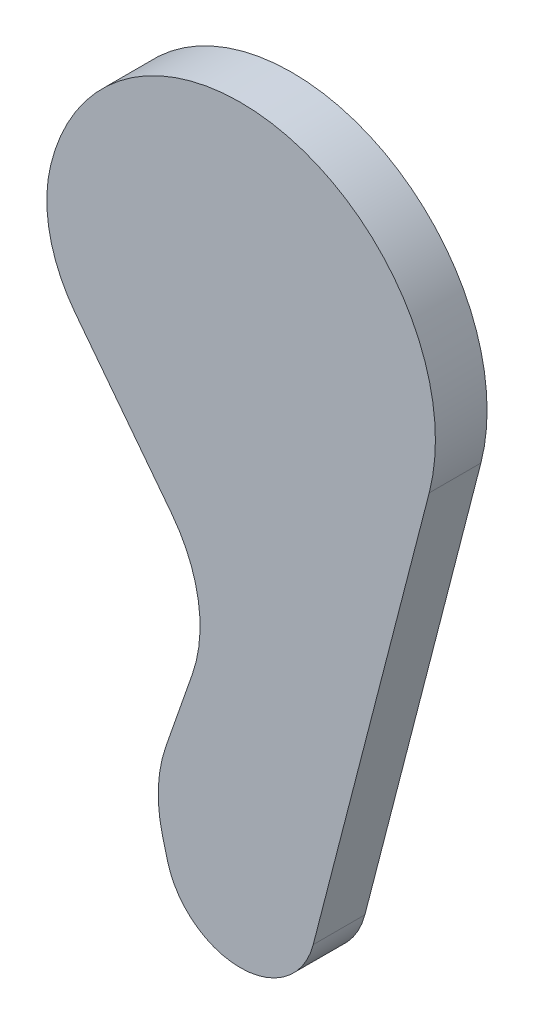
ISO-10303-21;
HEADER;
FILE_DESCRIPTION(('STEP AP214'),'2;1');
FILE_NAME('part.step','',(''),(''),'','','');
FILE_SCHEMA(('AUTOMOTIVE_DESIGN { 1 0 10303 214 1 1 1 1 }'));
ENDSEC;
DATA;
#1=APPLICATION_CONTEXT('core data for automotive mechanical design processes');
#2=APPLICATION_PROTOCOL_DEFINITION('international standard','automotive_design',2000,#1);
#3=PRODUCT_CONTEXT('',#1,'mechanical');
#4=PRODUCT('Part','Part','',(#3));
#5=PRODUCT_RELATED_PRODUCT_CATEGORY('part','',(#4));
#6=PRODUCT_DEFINITION_FORMATION('','',#4);
#7=PRODUCT_DEFINITION_CONTEXT('part definition',#1,'design');
#8=PRODUCT_DEFINITION('design','',#6,#7);
#9=PRODUCT_DEFINITION_SHAPE('','',#8);
#10=(LENGTH_UNIT() NAMED_UNIT(*) SI_UNIT(.MILLI.,.METRE.));
#11=(NAMED_UNIT(*) PLANE_ANGLE_UNIT() SI_UNIT($,.RADIAN.));
#12=(NAMED_UNIT(*) SI_UNIT($,.STERADIAN.) SOLID_ANGLE_UNIT());
#13=UNCERTAINTY_MEASURE_WITH_UNIT(LENGTH_MEASURE(1.E-05),#10,'distance_accuracy_value','');
#14=(GEOMETRIC_REPRESENTATION_CONTEXT(3) GLOBAL_UNCERTAINTY_ASSIGNED_CONTEXT((#13)) GLOBAL_UNIT_ASSIGNED_CONTEXT((#10,
#11,#12)) REPRESENTATION_CONTEXT('',''));
#15=CARTESIAN_POINT('',(0.,0.,0.));
#16=DIRECTION('',(0.,0.,1.));
#17=DIRECTION('',(1.,0.,0.));
#18=AXIS2_PLACEMENT_3D('',#15,#16,#17);
#19=CARTESIAN_POINT('',(0.,-70.,3.));
#20=DIRECTION('',(0.,0.,-1.));
#21=DIRECTION('',(-1.,0.,0.));
#22=AXIS2_PLACEMENT_3D('',#19,#20,#21);
#23=CYLINDRICAL_SURFACE('',#22,11.);
#24=DIRECTION('',(0.,0.,1.));
#25=VECTOR('',#24,1.);
#26=CARTESIAN_POINT('',(10.2953513590509,-66.1262756430421,-4.55));
#27=LINE('',#26,#25);
#28=CARTESIAN_POINT('',(10.2953513590509,-66.1262756430421,-4.55));
#29=VERTEX_POINT('',#28);
#30=CARTESIAN_POINT('',(10.2953513590509,-66.1262756430421,0.));
#31=VERTEX_POINT('',#30);
#32=EDGE_CURVE('E149',#29,#31,#27,.T.);
#33=ORIENTED_EDGE('',*,*,#32,.F.);
#34=CARTESIAN_POINT('',(0.,-70.,-4.55));
#35=DIRECTION('',(0.,0.,-1.));
#36=DIRECTION('',(-1.,0.,0.));
#37=AXIS2_PLACEMENT_3D('',#34,#35,#36);
#38=CIRCLE('',#37,11.);
#39=CARTESIAN_POINT('',(10.6507042020704,-72.75,-4.55));
#40=VERTEX_POINT('',#39);
#41=EDGE_CURVE('E161',#40,#29,#38,.T.);
#42=ORIENTED_EDGE('',*,*,#41,.F.);
#43=DIRECTION('',(0.,0.,-1.));
#44=VECTOR('',#43,1.);
#45=CARTESIAN_POINT('',(10.6507042020704,-72.75,3.));
#46=LINE('',#45,#44);
#47=CARTESIAN_POINT('',(10.6507042020704,-72.75,3.));
#48=VERTEX_POINT('',#47);
#49=EDGE_CURVE('E66',#48,#40,#46,.T.);
#50=ORIENTED_EDGE('',*,*,#49,.F.);
#51=CARTESIAN_POINT('',(0.,-70.,3.));
#52=DIRECTION('',(0.,0.,1.));
#53=DIRECTION('',(1.,0.,0.));
#54=AXIS2_PLACEMENT_3D('',#51,#52,#53);
#55=CIRCLE('',#54,11.);
#56=CARTESIAN_POINT('',(-10.6507042020704,-72.75,3.));
#57=VERTEX_POINT('',#56);
#58=EDGE_CURVE('E186',#57,#48,#55,.T.);
#59=ORIENTED_EDGE('',*,*,#58,.F.);
#60=DIRECTION('',(0.,0.,-1.));
#61=VECTOR('',#60,1.);
#62=CARTESIAN_POINT('',(-10.6507042020704,-72.75,3.));
#63=LINE('',#62,#61);
#64=CARTESIAN_POINT('',(-10.6507042020704,-72.75,0.));
#65=VERTEX_POINT('',#64);
#66=EDGE_CURVE('E195',#57,#65,#63,.T.);
#67=ORIENTED_EDGE('',*,*,#66,.T.);
#68=CARTESIAN_POINT('',(0.,-70.,0.));
#69=DIRECTION('',(0.,0.,-1.));
#70=DIRECTION('',(-1.,0.,0.));
#71=AXIS2_PLACEMENT_3D('',#68,#69,#70);
#72=CIRCLE('',#71,11.);
#73=EDGE_CURVE('E12',#65,#31,#72,.T.);
#74=ORIENTED_EDGE('',*,*,#73,.T.);
#75=EDGE_LOOP('',(#33,#42,#50,#59,#67,#74));
#76=FACE_BOUND('',#75,.T.);
#77=ADVANCED_FACE('F50',(#76),#23,.T.);
#78=CARTESIAN_POINT('',(0.,0.,0.));
#79=DIRECTION('',(0.,0.,1.));
#80=DIRECTION('',(1.,0.,0.));
#81=AXIS2_PLACEMENT_3D('',#78,#79,#80);
#82=PLANE('',#81);
#83=DIRECTION('',(0.25,0.968245836551854,0.));
#84=VECTOR('',#83,1.);
#85=CARTESIAN_POINT('',(10.2953513590509,-66.1262756430421,0.));
#86=LINE('',#85,#84);
#87=CARTESIAN_POINT('',(25.6585146686242,-6.62499999999997,0.));
#88=VERTEX_POINT('',#87);
#89=EDGE_CURVE('E269',#31,#88,#86,.T.);
#90=ORIENTED_EDGE('',*,*,#89,.F.);
#91=ORIENTED_EDGE('',*,*,#73,.F.);
#92=DIRECTION('',(0.25,-0.968245836551854,0.));
#93=VECTOR('',#92,1.);
#94=CARTESIAN_POINT('',(-27.5950063417278,-7.12500000000001,0.));
#95=LINE('',#94,#93);
#96=CARTESIAN_POINT('',(-11.3557061039309,-70.0195393750496,0.));
#97=VERTEX_POINT('',#96);
#98=EDGE_CURVE('E180',#97,#65,#95,.T.);
#99=ORIENTED_EDGE('',*,*,#98,.F.);
#100=CARTESIAN_POINT('',(8.00921062710618,-65.0195393750497,0.));
#101=DIRECTION('',(0.,0.,1.));
#102=DIRECTION('',(1.,0.,0.));
#103=AXIS2_PLACEMENT_3D('',#100,#101,#102);
#104=CIRCLE('',#103,20.);
#105=CARTESIAN_POINT('',(-10.8702555767009,-58.4191033395058,0.));
#106=VERTEX_POINT('',#105);
#107=EDGE_CURVE('E216',#97,#106,#104,.F.);
#108=ORIENTED_EDGE('',*,*,#107,.T.);
#109=DIRECTION('',(0.330021801777192,0.943973310190355,0.));
#110=VECTOR('',#109,1.);
#111=CARTESIAN_POINT('',(8.51307849523834,-2.97625099495946,0.));
#112=LINE('',#111,#110);
#113=CARTESIAN_POINT('',(-7.00149462201801,-47.3531462873932,0.));
#114=VERTEX_POINT('',#113);
#115=EDGE_CURVE('E197',#106,#114,#112,.T.);
#116=ORIENTED_EDGE('',*,*,#115,.T.);
#117=CARTESIAN_POINT('',(-25.8809608258251,-40.7527102518494,0.));
#118=DIRECTION('',(0.,0.,1.));
#119=DIRECTION('',(1.,0.,0.));
#120=AXIS2_PLACEMENT_3D('',#117,#118,#119);
#121=CIRCLE('',#120,20.);
#122=CARTESIAN_POINT('',(-10.0191798391824,-28.5705961524091,0.));
#123=VERTEX_POINT('',#122);
#124=EDGE_CURVE('E54',#114,#123,#121,.T.);
#125=ORIENTED_EDGE('',*,*,#124,.T.);
#126=DIRECTION('',(-0.609105704972012,0.793089049332134,0.));
#127=VECTOR('',#126,1.);
#128=CARTESIAN_POINT('',(-20.1037089124601,-15.43998596373,0.));
#129=LINE('',#128,#127);
#130=CARTESIAN_POINT('',(-24.1276033026681,-10.2006546777268,0.));
#131=VERTEX_POINT('',#130);
#132=EDGE_CURVE('E200',#123,#131,#129,.T.);
#133=ORIENTED_EDGE('',*,*,#132,.T.);
#134=CARTESIAN_POINT('',(-8.26582231602537,1.98145942171345,0.));
#135=DIRECTION('',(0.,0.,1.));
#136=DIRECTION('',(1.,0.,0.));
#137=AXIS2_PLACEMENT_3D('',#134,#135,#136);
#138=CIRCLE('',#137,20.);
#139=CARTESIAN_POINT('',(-27.7148160007909,6.64371688456864,0.));
#140=VERTEX_POINT('',#139);
#141=EDGE_CURVE('E213',#131,#140,#138,.F.);
#142=ORIENTED_EDGE('',*,*,#141,.T.);
#143=DIRECTION('',(-0.972449684238278,0.233112873142759,0.));
#144=VECTOR('',#143,1.);
#145=CARTESIAN_POINT('',(-25.7699166323144,6.17749113828312,0.));
#146=LINE('',#145,#144);
#147=CARTESIAN_POINT('',(-25.7699166323144,6.17749113828312,0.));
#148=VERTEX_POINT('',#147);
#149=EDGE_CURVE('E157',#148,#140,#146,.T.);
#150=ORIENTED_EDGE('',*,*,#149,.F.);
#151=CARTESIAN_POINT('',(0.,0.,0.));
#152=DIRECTION('',(0.,0.,1.));
#153=DIRECTION('',(-1.,0.,0.));
#154=AXIS2_PLACEMENT_3D('',#151,#152,#153);
#155=CIRCLE('',#154,26.5);
#156=EDGE_CURVE('E265',#88,#148,#155,.T.);
#157=ORIENTED_EDGE('',*,*,#156,.F.);
#158=EDGE_LOOP('',(#90,#91,#99,#108,#116,#125,#133,#142,#150,#157));
#159=FACE_BOUND('',#158,.T.);
#160=ADVANCED_FACE('F230',(#159),#82,.F.);
#161=CARTESIAN_POINT('',(0.,0.,3.));
#162=DIRECTION('',(0.,0.,-1.));
#163=DIRECTION('',(-1.,0.,0.));
#164=AXIS2_PLACEMENT_3D('',#161,#162,#163);
#165=CYLINDRICAL_SURFACE('',#164,28.5);
#166=DIRECTION('',(0.,0.,-1.));
#167=VECTOR('',#166,1.);
#168=CARTESIAN_POINT('',(27.5950063417279,-7.12499999999999,3.));
#169=LINE('',#168,#167);
#170=CARTESIAN_POINT('',(27.5950063417279,-7.12499999999999,3.));
#171=VERTEX_POINT('',#170);
#172=CARTESIAN_POINT('',(27.5950063417279,-7.12499999999999,-4.55));
#173=VERTEX_POINT('',#172);
#174=EDGE_CURVE('E190',#171,#173,#169,.T.);
#175=ORIENTED_EDGE('',*,*,#174,.T.);
#176=CARTESIAN_POINT('',(0.,0.,-4.55));
#177=DIRECTION('',(0.,0.,-1.));
#178=DIRECTION('',(-1.,0.,0.));
#179=AXIS2_PLACEMENT_3D('',#176,#177,#178);
#180=CIRCLE('',#179,28.5);
#181=CARTESIAN_POINT('',(-27.7148160007909,6.64371688456864,-4.55));
#182=VERTEX_POINT('',#181);
#183=EDGE_CURVE('E282',#182,#173,#180,.T.);
#184=ORIENTED_EDGE('',*,*,#183,.F.);
#185=DIRECTION('',(0.,0.,1.));
#186=VECTOR('',#185,1.);
#187=CARTESIAN_POINT('',(-27.7148160007909,6.64371688456864,-4.55));
#188=LINE('',#187,#186);
#189=EDGE_CURVE('E261',#182,#140,#188,.T.);
#190=ORIENTED_EDGE('',*,*,#189,.T.);
#191=DIRECTION('',(0.,0.,-1.));
#192=VECTOR('',#191,1.);
#193=CARTESIAN_POINT('',(-27.714816000791,6.64371688456864,3.));
#194=LINE('',#193,#192);
#195=CARTESIAN_POINT('',(-27.714816000791,6.64371688456864,3.));
#196=VERTEX_POINT('',#195);
#197=EDGE_CURVE('E222',#140,#196,#194,.F.);
#198=ORIENTED_EDGE('',*,*,#197,.T.);
#199=CARTESIAN_POINT('',(0.,0.,3.));
#200=DIRECTION('',(0.,0.,1.));
#201=DIRECTION('',(1.,0.,0.));
#202=AXIS2_PLACEMENT_3D('',#199,#200,#201);
#203=CIRCLE('',#202,28.5);
#204=EDGE_CURVE('E181',#171,#196,#203,.T.);
#205=ORIENTED_EDGE('',*,*,#204,.F.);
#206=EDGE_LOOP('',(#175,#184,#190,#198,#205));
#207=FACE_BOUND('',#206,.T.);
#208=ADVANCED_FACE('F257',(#207),#165,.T.);
#209=CARTESIAN_POINT('',(-27.5950063417278,-7.12500000000001,3.));
#210=DIRECTION('',(0.968245836551854,0.25,0.));
#211=DIRECTION('',(-0.25,0.968245836551854,0.));
#212=AXIS2_PLACEMENT_3D('',#209,#210,#211);
#213=PLANE('',#212);
#214=DIRECTION('',(0.25,-0.968245836551854,0.));
#215=VECTOR('',#214,1.);
#216=CARTESIAN_POINT('',(-27.5950063417278,-7.12500000000001,3.));
#217=LINE('',#216,#215);
#218=CARTESIAN_POINT('',(-11.3557061039309,-70.0195393750496,3.));
#219=VERTEX_POINT('',#218);
#220=EDGE_CURVE('E184',#219,#57,#217,.T.);
#221=ORIENTED_EDGE('',*,*,#220,.F.);
#222=DIRECTION('',(0.,0.,1.));
#223=VECTOR('',#222,1.);
#224=CARTESIAN_POINT('',(-11.3557061039309,-70.0195393750497,3.));
#225=LINE('',#224,#223);
#226=EDGE_CURVE('E211',#219,#97,#225,.F.);
#227=ORIENTED_EDGE('',*,*,#226,.T.);
#228=ORIENTED_EDGE('',*,*,#98,.T.);
#229=ORIENTED_EDGE('',*,*,#66,.F.);
#230=EDGE_LOOP('',(#221,#227,#228,#229));
#231=FACE_BOUND('',#230,.T.);
#232=ADVANCED_FACE('F247',(#231),#213,.F.);
#233=CARTESIAN_POINT('',(27.5950063417279,-7.12499999999999,3.));
#234=DIRECTION('',(-0.968245836551854,0.25,0.));
#235=DIRECTION('',(-0.25,-0.968245836551854,0.));
#236=AXIS2_PLACEMENT_3D('',#233,#234,#235);
#237=PLANE('',#236);
#238=ORIENTED_EDGE('',*,*,#49,.T.);
#239=DIRECTION('',(-0.25,-0.968245836551854,0.));
#240=VECTOR('',#239,1.);
#241=CARTESIAN_POINT('',(10.6507042020704,-72.75,-4.55));
#242=LINE('',#241,#240);
#243=EDGE_CURVE('E168',#173,#40,#242,.T.);
#244=ORIENTED_EDGE('',*,*,#243,.F.);
#245=ORIENTED_EDGE('',*,*,#174,.F.);
#246=DIRECTION('',(0.25,0.968245836551854,0.));
#247=VECTOR('',#246,1.);
#248=CARTESIAN_POINT('',(27.5950063417279,-7.12499999999999,3.));
#249=LINE('',#248,#247);
#250=EDGE_CURVE('E188',#48,#171,#249,.T.);
#251=ORIENTED_EDGE('',*,*,#250,.F.);
#252=EDGE_LOOP('',(#238,#244,#245,#251));
#253=FACE_BOUND('',#252,.T.);
#254=ADVANCED_FACE('F254',(#253),#237,.F.);
#255=CARTESIAN_POINT('',(0.,0.,3.));
#256=DIRECTION('',(0.,0.,1.));
#257=DIRECTION('',(1.,0.,0.));
#258=AXIS2_PLACEMENT_3D('',#255,#256,#257);
#259=PLANE('',#258);
#260=DIRECTION('',(0.330021801777192,0.943973310190355,0.));
#261=VECTOR('',#260,1.);
#262=CARTESIAN_POINT('',(-12.8723256889961,-64.14569697956,3.));
#263=LINE('',#262,#261);
#264=CARTESIAN_POINT('',(-10.8702555767009,-58.4191033395058,3.));
#265=VERTEX_POINT('',#264);
#266=CARTESIAN_POINT('',(-7.00149462201801,-47.3531462873932,3.));
#267=VERTEX_POINT('',#266);
#268=EDGE_CURVE('E169',#265,#267,#263,.T.);
#269=ORIENTED_EDGE('',*,*,#268,.F.);
#270=CARTESIAN_POINT('',(8.00921062710618,-65.0195393750497,3.));
#271=DIRECTION('',(0.,0.,1.));
#272=DIRECTION('',(1.,0.,0.));
#273=AXIS2_PLACEMENT_3D('',#270,#271,#272);
#274=CIRCLE('',#273,20.);
#275=EDGE_CURVE('E209',#265,#219,#274,.T.);
#276=ORIENTED_EDGE('',*,*,#275,.T.);
#277=ORIENTED_EDGE('',*,*,#220,.T.);
#278=ORIENTED_EDGE('',*,*,#58,.T.);
#279=ORIENTED_EDGE('',*,*,#250,.T.);
#280=ORIENTED_EDGE('',*,*,#204,.T.);
#281=CARTESIAN_POINT('',(-8.26582231602537,1.98145942171345,3.));
#282=DIRECTION('',(0.,0.,1.));
#283=DIRECTION('',(1.,0.,0.));
#284=AXIS2_PLACEMENT_3D('',#281,#282,#283);
#285=CIRCLE('',#284,20.);
#286=CARTESIAN_POINT('',(-24.1276033026681,-10.2006546777268,3.));
#287=VERTEX_POINT('',#286);
#288=EDGE_CURVE('E207',#196,#287,#285,.T.);
#289=ORIENTED_EDGE('',*,*,#288,.T.);
#290=DIRECTION('',(-0.609105704972012,0.793089049332134,0.));
#291=VECTOR('',#290,1.);
#292=CARTESIAN_POINT('',(-3.43302685600075,-37.1461287168719,3.));
#293=LINE('',#292,#291);
#294=CARTESIAN_POINT('',(-10.0191798391824,-28.5705961524091,3.));
#295=VERTEX_POINT('',#294);
#296=EDGE_CURVE('E173',#295,#287,#293,.T.);
#297=ORIENTED_EDGE('',*,*,#296,.F.);
#298=CARTESIAN_POINT('',(-25.8809608258251,-40.7527102518494,3.));
#299=DIRECTION('',(0.,0.,1.));
#300=DIRECTION('',(1.,0.,0.));
#301=AXIS2_PLACEMENT_3D('',#298,#299,#300);
#302=CIRCLE('',#301,20.);
#303=EDGE_CURVE('E224',#295,#267,#302,.F.);
#304=ORIENTED_EDGE('',*,*,#303,.T.);
#305=EDGE_LOOP('',(#269,#276,#277,#278,#279,#280,#289,#297,#304));
#306=FACE_BOUND('',#305,.T.);
#307=ADVANCED_FACE('F241',(#306),#259,.T.);
#308=CARTESIAN_POINT('',(-3.43302685600075,-37.1461287168719,-7.));
#309=DIRECTION('',(0.793089049332134,0.609105704972012,0.));
#310=DIRECTION('',(-0.609105704972012,0.793089049332134,0.));
#311=AXIS2_PLACEMENT_3D('',#308,#309,#310);
#312=PLANE('',#311);
#313=ORIENTED_EDGE('',*,*,#132,.F.);
#314=DIRECTION('',(0.,0.,1.));
#315=VECTOR('',#314,1.);
#316=CARTESIAN_POINT('',(-10.0191798391824,-28.5705961524091,3.));
#317=LINE('',#316,#315);
#318=EDGE_CURVE('E219',#123,#295,#317,.T.);
#319=ORIENTED_EDGE('',*,*,#318,.T.);
#320=ORIENTED_EDGE('',*,*,#296,.T.);
#321=DIRECTION('',(0.,0.,-1.));
#322=VECTOR('',#321,1.);
#323=CARTESIAN_POINT('',(-24.1276033026681,-10.2006546777268,-7.));
#324=LINE('',#323,#322);
#325=EDGE_CURVE('E74',#287,#131,#324,.T.);
#326=ORIENTED_EDGE('',*,*,#325,.T.);
#327=EDGE_LOOP('',(#313,#319,#320,#326));
#328=FACE_BOUND('',#327,.T.);
#329=ADVANCED_FACE('F236',(#328),#312,.F.);
#330=CARTESIAN_POINT('',(-12.8723256889961,-64.14569697956,-7.));
#331=DIRECTION('',(0.943973310190355,-0.330021801777192,0.));
#332=DIRECTION('',(0.330021801777192,0.943973310190355,0.));
#333=AXIS2_PLACEMENT_3D('',#330,#331,#332);
#334=PLANE('',#333);
#335=ORIENTED_EDGE('',*,*,#115,.F.);
#336=DIRECTION('',(0.,0.,1.));
#337=VECTOR('',#336,1.);
#338=CARTESIAN_POINT('',(-10.8702555767009,-58.4191033395058,-7.));
#339=LINE('',#338,#337);
#340=EDGE_CURVE('E204',#106,#265,#339,.T.);
#341=ORIENTED_EDGE('',*,*,#340,.T.);
#342=ORIENTED_EDGE('',*,*,#268,.T.);
#343=DIRECTION('',(0.,0.,1.));
#344=VECTOR('',#343,1.);
#345=CARTESIAN_POINT('',(-7.00149462201801,-47.3531462873932,0.));
#346=LINE('',#345,#344);
#347=EDGE_CURVE('E202',#267,#114,#346,.F.);
#348=ORIENTED_EDGE('',*,*,#347,.T.);
#349=EDGE_LOOP('',(#335,#341,#342,#348));
#350=FACE_BOUND('',#349,.T.);
#351=ADVANCED_FACE('F239',(#350),#334,.F.);
#352=CARTESIAN_POINT('',(8.00921062710618,-65.0195393750497,-7.));
#353=DIRECTION('',(0.,0.,1.));
#354=DIRECTION('',(1.,0.,0.));
#355=AXIS2_PLACEMENT_3D('',#352,#353,#354);
#356=CYLINDRICAL_SURFACE('',#355,20.);
#357=ORIENTED_EDGE('',*,*,#107,.F.);
#358=ORIENTED_EDGE('',*,*,#226,.F.);
#359=ORIENTED_EDGE('',*,*,#275,.F.);
#360=ORIENTED_EDGE('',*,*,#340,.F.);
#361=EDGE_LOOP('',(#357,#358,#359,#360));
#362=FACE_BOUND('',#361,.T.);
#363=ADVANCED_FACE('F251',(#362),#356,.T.);
#364=CARTESIAN_POINT('',(-25.8809608258251,-40.7527102518494,-7.));
#365=DIRECTION('',(0.,0.,-1.));
#366=DIRECTION('',(-1.,0.,0.));
#367=AXIS2_PLACEMENT_3D('',#364,#365,#366);
#368=CYLINDRICAL_SURFACE('',#367,20.);
#369=ORIENTED_EDGE('',*,*,#124,.F.);
#370=ORIENTED_EDGE('',*,*,#347,.F.);
#371=ORIENTED_EDGE('',*,*,#303,.F.);
#372=ORIENTED_EDGE('',*,*,#318,.F.);
#373=EDGE_LOOP('',(#369,#370,#371,#372));
#374=FACE_BOUND('',#373,.T.);
#375=ADVANCED_FACE('F237',(#374),#368,.F.);
#376=CARTESIAN_POINT('',(-8.26582231602537,1.98145942171345,3.));
#377=DIRECTION('',(0.,0.,-1.));
#378=DIRECTION('',(-1.,0.,0.));
#379=AXIS2_PLACEMENT_3D('',#376,#377,#378);
#380=CYLINDRICAL_SURFACE('',#379,20.);
#381=ORIENTED_EDGE('',*,*,#141,.F.);
#382=ORIENTED_EDGE('',*,*,#325,.F.);
#383=ORIENTED_EDGE('',*,*,#288,.F.);
#384=ORIENTED_EDGE('',*,*,#197,.F.);
#385=EDGE_LOOP('',(#381,#382,#383,#384));
#386=FACE_BOUND('',#385,.T.);
#387=ADVANCED_FACE('F52',(#386),#380,.T.);
#388=CARTESIAN_POINT('',(0.,-70.,-4.55));
#389=DIRECTION('',(0.,0.,-1.));
#390=DIRECTION('',(-1.,0.,0.));
#391=AXIS2_PLACEMENT_3D('',#388,#389,#390);
#392=PLANE('',#391);
#393=ORIENTED_EDGE('',*,*,#41,.T.);
#394=DIRECTION('',(0.25,0.968245836551854,0.));
#395=VECTOR('',#394,1.);
#396=CARTESIAN_POINT('',(10.2953513590509,-66.1262756430421,-4.55));
#397=LINE('',#396,#395);
#398=CARTESIAN_POINT('',(25.6585146686242,-6.62499999999997,-4.55));
#399=VERTEX_POINT('',#398);
#400=EDGE_CURVE('E146',#29,#399,#397,.T.);
#401=ORIENTED_EDGE('',*,*,#400,.T.);
#402=CARTESIAN_POINT('',(0.,0.,-4.55));
#403=DIRECTION('',(0.,0.,1.));
#404=DIRECTION('',(-1.,0.,0.));
#405=AXIS2_PLACEMENT_3D('',#402,#403,#404);
#406=CIRCLE('',#405,26.5);
#407=CARTESIAN_POINT('',(-25.7699166323144,6.17749113828312,-4.55));
#408=VERTEX_POINT('',#407);
#409=EDGE_CURVE('E156',#399,#408,#406,.T.);
#410=ORIENTED_EDGE('',*,*,#409,.T.);
#411=DIRECTION('',(-0.972449684238278,0.233112873142759,0.));
#412=VECTOR('',#411,1.);
#413=CARTESIAN_POINT('',(-25.7699166323144,6.17749113828312,-4.55));
#414=LINE('',#413,#412);
#415=EDGE_CURVE('E280',#408,#182,#414,.T.);
#416=ORIENTED_EDGE('',*,*,#415,.T.);
#417=ORIENTED_EDGE('',*,*,#183,.T.);
#418=ORIENTED_EDGE('',*,*,#243,.T.);
#419=EDGE_LOOP('',(#393,#401,#410,#416,#417,#418));
#420=FACE_BOUND('',#419,.T.);
#421=CARTESIAN_POINT('',(0.,-70.,-4.55));
#422=DIRECTION('',(0.,0.,-1.));
#423=DIRECTION('',(-1.,0.,0.));
#424=AXIS2_PLACEMENT_3D('',#421,#422,#423);
#425=CIRCLE('',#424,9.);
#426=CARTESIAN_POINT('',(-8.99999999999998,-70.,-4.55));
#427=VERTEX_POINT('',#426);
#428=EDGE_CURVE('E170',#427,#427,#425,.T.);
#429=ORIENTED_EDGE('',*,*,#428,.F.);
#430=EDGE_LOOP('',(#429));
#431=FACE_BOUND('',#430,.T.);
#432=ADVANCED_FACE('F165',(#420,#431),#392,.T.);
#433=CARTESIAN_POINT('',(0.,-70.,-4.55));
#434=DIRECTION('',(0.,0.,1.));
#435=DIRECTION('',(1.,0.,0.));
#436=AXIS2_PLACEMENT_3D('',#433,#434,#435);
#437=CYLINDRICAL_SURFACE('',#436,9.);
#438=ORIENTED_EDGE('',*,*,#428,.T.);
#439=EDGE_LOOP('',(#438));
#440=FACE_BOUND('',#439,.T.);
#441=CARTESIAN_POINT('',(0.,-70.,0.));
#442=DIRECTION('',(0.,0.,-1.));
#443=DIRECTION('',(-1.,0.,0.));
#444=AXIS2_PLACEMENT_3D('',#441,#442,#443);
#445=CIRCLE('',#444,9.);
#446=CARTESIAN_POINT('',(-8.99999999999998,-70.,0.));
#447=VERTEX_POINT('',#446);
#448=EDGE_CURVE('E163',#447,#447,#445,.T.);
#449=ORIENTED_EDGE('',*,*,#448,.F.);
#450=EDGE_LOOP('',(#449));
#451=FACE_BOUND('',#450,.T.);
#452=ADVANCED_FACE('F316',(#440,#451),#437,.F.);
#453=ORIENTED_EDGE('',*,*,#448,.T.);
#454=EDGE_LOOP('',(#453));
#455=FACE_BOUND('',#454,.T.);
#456=ADVANCED_FACE('F300',(#455),#82,.F.);
#457=CARTESIAN_POINT('',(10.2953513590509,-66.1262756430421,-4.55));
#458=DIRECTION('',(0.968245836551854,-0.25,0.));
#459=DIRECTION('',(0.25,0.968245836551854,0.));
#460=AXIS2_PLACEMENT_3D('',#457,#458,#459);
#461=PLANE('',#460);
#462=ORIENTED_EDGE('',*,*,#89,.T.);
#463=DIRECTION('',(0.,0.,1.));
#464=VECTOR('',#463,1.);
#465=CARTESIAN_POINT('',(25.6585146686242,-6.62499999999997,-4.55));
#466=LINE('',#465,#464);
#467=EDGE_CURVE('E152',#399,#88,#466,.T.);
#468=ORIENTED_EDGE('',*,*,#467,.F.);
#469=ORIENTED_EDGE('',*,*,#400,.F.);
#470=ORIENTED_EDGE('',*,*,#32,.T.);
#471=EDGE_LOOP('',(#462,#468,#469,#470));
#472=FACE_BOUND('',#471,.T.);
#473=ADVANCED_FACE('F148',(#472),#461,.F.);
#474=CARTESIAN_POINT('',(0.,0.,-4.55));
#475=DIRECTION('',(0.,0.,1.));
#476=DIRECTION('',(1.,0.,0.));
#477=AXIS2_PLACEMENT_3D('',#474,#475,#476);
#478=CYLINDRICAL_SURFACE('',#477,26.5);
#479=ORIENTED_EDGE('',*,*,#156,.T.);
#480=DIRECTION('',(0.,0.,1.));
#481=VECTOR('',#480,1.);
#482=CARTESIAN_POINT('',(-25.7699166323144,6.17749113828312,-4.55));
#483=LINE('',#482,#481);
#484=EDGE_CURVE('E274',#408,#148,#483,.T.);
#485=ORIENTED_EDGE('',*,*,#484,.F.);
#486=ORIENTED_EDGE('',*,*,#409,.F.);
#487=ORIENTED_EDGE('',*,*,#467,.T.);
#488=EDGE_LOOP('',(#479,#485,#486,#487));
#489=FACE_BOUND('',#488,.T.);
#490=ADVANCED_FACE('F277',(#489),#478,.F.);
#491=CARTESIAN_POINT('',(-25.7699166323144,6.17749113828312,-4.55));
#492=DIRECTION('',(0.23311287314276,0.972449684238279,0.));
#493=DIRECTION('',(-0.972449684238279,0.23311287314276,0.));
#494=AXIS2_PLACEMENT_3D('',#491,#492,#493);
#495=PLANE('',#494);
#496=ORIENTED_EDGE('',*,*,#149,.T.);
#497=ORIENTED_EDGE('',*,*,#189,.F.);
#498=ORIENTED_EDGE('',*,*,#415,.F.);
#499=ORIENTED_EDGE('',*,*,#484,.T.);
#500=EDGE_LOOP('',(#496,#497,#498,#499));
#501=FACE_BOUND('',#500,.T.);
#502=ADVANCED_FACE('F286',(#501),#495,.F.);
#503=CLOSED_SHELL('',(#77,#160,#208,#232,#254,#307,#329,#351,#363,#375,#387,#432,#452,#456,#473,
#490,#502));
#504=MANIFOLD_SOLID_BREP('B2',#503);
#505=ADVANCED_BREP_SHAPE_REPRESENTATION('',(#18,#504),#14);
#506=SHAPE_DEFINITION_REPRESENTATION(#9,#505);
ENDSEC;
END-ISO-10303-21;
